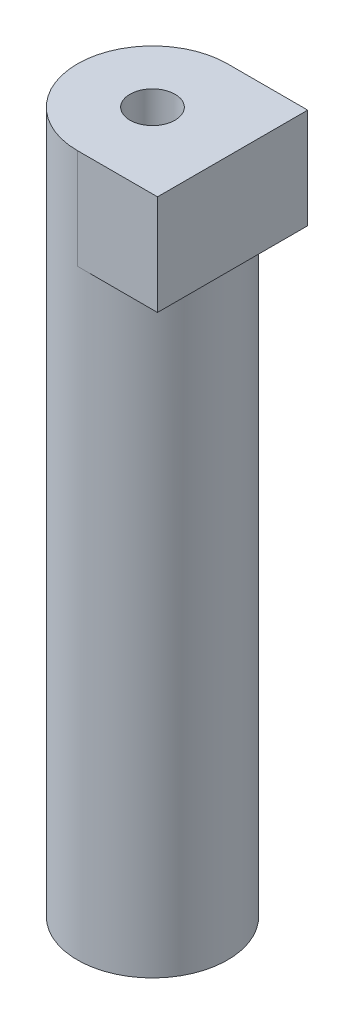
ISO-10303-21;
HEADER;
FILE_DESCRIPTION(('STEP AP214'),'2;1');
FILE_NAME('part.step','',(''),(''),'','','');
FILE_SCHEMA(('AUTOMOTIVE_DESIGN { 1 0 10303 214 1 1 1 1 }'));
ENDSEC;
DATA;
#1=APPLICATION_CONTEXT('core data for automotive mechanical design processes');
#2=APPLICATION_PROTOCOL_DEFINITION('international standard','automotive_design',2000,#1);
#3=PRODUCT_CONTEXT('',#1,'mechanical');
#4=PRODUCT('Part','Part','',(#3));
#5=PRODUCT_RELATED_PRODUCT_CATEGORY('part','',(#4));
#6=PRODUCT_DEFINITION_FORMATION('','',#4);
#7=PRODUCT_DEFINITION_CONTEXT('part definition',#1,'design');
#8=PRODUCT_DEFINITION('design','',#6,#7);
#9=PRODUCT_DEFINITION_SHAPE('','',#8);
#10=(LENGTH_UNIT() NAMED_UNIT(*) SI_UNIT(.MILLI.,.METRE.));
#11=(NAMED_UNIT(*) PLANE_ANGLE_UNIT() SI_UNIT($,.RADIAN.));
#12=(NAMED_UNIT(*) SI_UNIT($,.STERADIAN.) SOLID_ANGLE_UNIT());
#13=UNCERTAINTY_MEASURE_WITH_UNIT(LENGTH_MEASURE(1.E-05),#10,'distance_accuracy_value','');
#14=(GEOMETRIC_REPRESENTATION_CONTEXT(3) GLOBAL_UNCERTAINTY_ASSIGNED_CONTEXT((#13)) GLOBAL_UNIT_ASSIGNED_CONTEXT((#10,
#11,#12)) REPRESENTATION_CONTEXT('',''));
#15=CARTESIAN_POINT('',(0.,0.,0.));
#16=DIRECTION('',(0.,0.,1.));
#17=DIRECTION('',(1.,0.,0.));
#18=AXIS2_PLACEMENT_3D('',#15,#16,#17);
#19=CARTESIAN_POINT('',(0.,160.,0.));
#20=DIRECTION('',(0.,-1.,0.));
#21=DIRECTION('',(0.,0.,-1.));
#22=AXIS2_PLACEMENT_3D('',#19,#20,#21);
#23=CYLINDRICAL_SURFACE('',#22,7.5);
#24=CARTESIAN_POINT('',(0.,160.,0.));
#25=DIRECTION('',(0.,1.,0.));
#26=DIRECTION('',(0.,0.,1.));
#27=AXIS2_PLACEMENT_3D('',#24,#25,#26);
#28=CIRCLE('',#27,7.5);
#29=CARTESIAN_POINT('',(0.,160.,-7.5));
#30=VERTEX_POINT('',#29);
#31=CARTESIAN_POINT('',(0.,160.,7.5));
#32=VERTEX_POINT('',#31);
#33=EDGE_CURVE('E11',#30,#32,#28,.T.);
#34=ORIENTED_EDGE('',*,*,#33,.F.);
#35=DIRECTION('',(0.,1.,0.));
#36=VECTOR('',#35,1.);
#37=CARTESIAN_POINT('',(0.,150.,-7.5));
#38=LINE('',#37,#36);
#39=CARTESIAN_POINT('',(0.,150.,-7.5));
#40=VERTEX_POINT('',#39);
#41=EDGE_CURVE('E107',#40,#30,#38,.T.);
#42=ORIENTED_EDGE('',*,*,#41,.F.);
#43=CARTESIAN_POINT('',(0.,150.,0.));
#44=DIRECTION('',(0.,-1.,0.));
#45=DIRECTION('',(0.,0.,1.));
#46=AXIS2_PLACEMENT_3D('',#43,#44,#45);
#47=CIRCLE('',#46,7.5);
#48=CARTESIAN_POINT('',(0.,150.,7.5));
#49=VERTEX_POINT('',#48);
#50=EDGE_CURVE('E59',#40,#49,#47,.T.);
#51=ORIENTED_EDGE('',*,*,#50,.T.);
#52=DIRECTION('',(0.,1.,0.));
#53=VECTOR('',#52,1.);
#54=CARTESIAN_POINT('',(0.,150.,7.5));
#55=LINE('',#54,#53);
#56=EDGE_CURVE('E83',#49,#32,#55,.T.);
#57=ORIENTED_EDGE('',*,*,#56,.T.);
#58=EDGE_LOOP('',(#34,#42,#51,#57));
#59=FACE_BOUND('',#58,.T.);
#60=CARTESIAN_POINT('',(0.,90.,0.));
#61=DIRECTION('',(0.,-1.,0.));
#62=DIRECTION('',(0.,0.,-1.));
#63=AXIS2_PLACEMENT_3D('',#60,#61,#62);
#64=CIRCLE('',#63,7.5);
#65=CARTESIAN_POINT('',(0.,90.,-7.5));
#66=VERTEX_POINT('',#65);
#67=EDGE_CURVE('E104',#66,#66,#64,.T.);
#68=ORIENTED_EDGE('',*,*,#67,.F.);
#69=EDGE_LOOP('',(#68));
#70=FACE_BOUND('',#69,.T.);
#71=ADVANCED_FACE('F36',(#59,#70),#23,.T.);
#72=CARTESIAN_POINT('',(0.,80.,0.));
#73=DIRECTION('',(0.,1.,0.));
#74=DIRECTION('',(0.,0.,1.));
#75=AXIS2_PLACEMENT_3D('',#72,#73,#74);
#76=CYLINDRICAL_SURFACE('',#75,2.25);
#77=CARTESIAN_POINT('',(0.,160.,0.));
#78=DIRECTION('',(0.,1.,0.));
#79=DIRECTION('',(0.,0.,1.));
#80=AXIS2_PLACEMENT_3D('',#77,#78,#79);
#81=CIRCLE('',#80,2.25);
#82=CARTESIAN_POINT('',(0.,160.,2.25));
#83=VERTEX_POINT('',#82);
#84=EDGE_CURVE('E44',#83,#83,#81,.T.);
#85=ORIENTED_EDGE('',*,*,#84,.T.);
#86=EDGE_LOOP('',(#85));
#87=FACE_BOUND('',#86,.T.);
#88=CARTESIAN_POINT('',(0.,90.,0.));
#89=DIRECTION('',(0.,-1.,0.));
#90=DIRECTION('',(0.,0.,-1.));
#91=AXIS2_PLACEMENT_3D('',#88,#89,#90);
#92=CIRCLE('',#91,2.25);
#93=CARTESIAN_POINT('',(0.,90.,-2.25));
#94=VERTEX_POINT('',#93);
#95=EDGE_CURVE('E39',#94,#94,#92,.F.);
#96=ORIENTED_EDGE('',*,*,#95,.F.);
#97=EDGE_LOOP('',(#96));
#98=FACE_BOUND('',#97,.T.);
#99=ADVANCED_FACE('F114',(#87,#98),#76,.F.);
#100=CARTESIAN_POINT('',(0.,160.,0.));
#101=DIRECTION('',(0.,1.,0.));
#102=DIRECTION('',(0.,0.,1.));
#103=AXIS2_PLACEMENT_3D('',#100,#101,#102);
#104=PLANE('',#103);
#105=ORIENTED_EDGE('',*,*,#84,.F.);
#106=EDGE_LOOP('',(#105));
#107=FACE_BOUND('',#106,.T.);
#108=ORIENTED_EDGE('',*,*,#33,.T.);
#109=DIRECTION('',(1.,0.,0.));
#110=VECTOR('',#109,1.);
#111=CARTESIAN_POINT('',(0.,160.,7.5));
#112=LINE('',#111,#110);
#113=CARTESIAN_POINT('',(8.,160.,7.5));
#114=VERTEX_POINT('',#113);
#115=EDGE_CURVE('E102',#32,#114,#112,.T.);
#116=ORIENTED_EDGE('',*,*,#115,.T.);
#117=DIRECTION('',(0.,0.,-1.));
#118=VECTOR('',#117,1.);
#119=CARTESIAN_POINT('',(8.,160.,7.5));
#120=LINE('',#119,#118);
#121=CARTESIAN_POINT('',(8.,160.,-7.5));
#122=VERTEX_POINT('',#121);
#123=EDGE_CURVE('E89',#114,#122,#120,.T.);
#124=ORIENTED_EDGE('',*,*,#123,.T.);
#125=DIRECTION('',(-1.,0.,0.));
#126=VECTOR('',#125,1.);
#127=CARTESIAN_POINT('',(8.,160.,-7.5));
#128=LINE('',#127,#126);
#129=EDGE_CURVE('E50',#122,#30,#128,.T.);
#130=ORIENTED_EDGE('',*,*,#129,.T.);
#131=EDGE_LOOP('',(#108,#116,#124,#130));
#132=FACE_BOUND('',#131,.T.);
#133=ADVANCED_FACE('F117',(#107,#132),#104,.T.);
#134=CARTESIAN_POINT('',(8.,150.,-7.5));
#135=DIRECTION('',(0.,0.,-1.));
#136=DIRECTION('',(-1.,0.,0.));
#137=AXIS2_PLACEMENT_3D('',#134,#135,#136);
#138=PLANE('',#137);
#139=ORIENTED_EDGE('',*,*,#129,.F.);
#140=DIRECTION('',(0.,1.,0.));
#141=VECTOR('',#140,1.);
#142=CARTESIAN_POINT('',(8.,150.,-7.5));
#143=LINE('',#142,#141);
#144=CARTESIAN_POINT('',(8.,150.,-7.5));
#145=VERTEX_POINT('',#144);
#146=EDGE_CURVE('E77',#145,#122,#143,.T.);
#147=ORIENTED_EDGE('',*,*,#146,.F.);
#148=DIRECTION('',(-1.,0.,0.));
#149=VECTOR('',#148,1.);
#150=CARTESIAN_POINT('',(8.,150.,-7.5));
#151=LINE('',#150,#149);
#152=EDGE_CURVE('E94',#145,#40,#151,.T.);
#153=ORIENTED_EDGE('',*,*,#152,.T.);
#154=ORIENTED_EDGE('',*,*,#41,.T.);
#155=EDGE_LOOP('',(#139,#147,#153,#154));
#156=FACE_BOUND('',#155,.T.);
#157=ADVANCED_FACE('F119',(#156),#138,.T.);
#158=CARTESIAN_POINT('',(8.,150.,7.5));
#159=DIRECTION('',(1.,0.,0.));
#160=DIRECTION('',(0.,0.,-1.));
#161=AXIS2_PLACEMENT_3D('',#158,#159,#160);
#162=PLANE('',#161);
#163=ORIENTED_EDGE('',*,*,#123,.F.);
#164=DIRECTION('',(0.,1.,0.));
#165=VECTOR('',#164,1.);
#166=CARTESIAN_POINT('',(8.,150.,7.5));
#167=LINE('',#166,#165);
#168=CARTESIAN_POINT('',(8.,150.,7.5));
#169=VERTEX_POINT('',#168);
#170=EDGE_CURVE('E85',#169,#114,#167,.T.);
#171=ORIENTED_EDGE('',*,*,#170,.F.);
#172=DIRECTION('',(0.,0.,-1.));
#173=VECTOR('',#172,1.);
#174=CARTESIAN_POINT('',(8.,150.,7.5));
#175=LINE('',#174,#173);
#176=EDGE_CURVE('E88',#169,#145,#175,.T.);
#177=ORIENTED_EDGE('',*,*,#176,.T.);
#178=ORIENTED_EDGE('',*,*,#146,.T.);
#179=EDGE_LOOP('',(#163,#171,#177,#178));
#180=FACE_BOUND('',#179,.T.);
#181=ADVANCED_FACE('F87',(#180),#162,.T.);
#182=CARTESIAN_POINT('',(0.,150.,7.5));
#183=DIRECTION('',(0.,0.,1.));
#184=DIRECTION('',(1.,0.,0.));
#185=AXIS2_PLACEMENT_3D('',#182,#183,#184);
#186=PLANE('',#185);
#187=ORIENTED_EDGE('',*,*,#115,.F.);
#188=ORIENTED_EDGE('',*,*,#56,.F.);
#189=DIRECTION('',(1.,0.,0.));
#190=VECTOR('',#189,1.);
#191=CARTESIAN_POINT('',(0.,150.,7.5));
#192=LINE('',#191,#190);
#193=EDGE_CURVE('E93',#49,#169,#192,.T.);
#194=ORIENTED_EDGE('',*,*,#193,.T.);
#195=ORIENTED_EDGE('',*,*,#170,.T.);
#196=EDGE_LOOP('',(#187,#188,#194,#195));
#197=FACE_BOUND('',#196,.T.);
#198=ADVANCED_FACE('F96',(#197),#186,.T.);
#199=CARTESIAN_POINT('',(0.,150.,0.));
#200=DIRECTION('',(0.,1.,0.));
#201=DIRECTION('',(0.,0.,1.));
#202=AXIS2_PLACEMENT_3D('',#199,#200,#201);
#203=PLANE('',#202);
#204=ORIENTED_EDGE('',*,*,#50,.F.);
#205=ORIENTED_EDGE('',*,*,#152,.F.);
#206=ORIENTED_EDGE('',*,*,#176,.F.);
#207=ORIENTED_EDGE('',*,*,#193,.F.);
#208=EDGE_LOOP('',(#204,#205,#206,#207));
#209=FACE_BOUND('',#208,.T.);
#210=ADVANCED_FACE('F92',(#209),#203,.F.);
#211=CARTESIAN_POINT('',(0.,90.,0.));
#212=DIRECTION('',(0.,-1.,0.));
#213=DIRECTION('',(0.,0.,-1.));
#214=AXIS2_PLACEMENT_3D('',#211,#212,#213);
#215=PLANE('',#214);
#216=ORIENTED_EDGE('',*,*,#95,.T.);
#217=EDGE_LOOP('',(#216));
#218=FACE_BOUND('',#217,.T.);
#219=ORIENTED_EDGE('',*,*,#67,.T.);
#220=EDGE_LOOP('',(#219));
#221=FACE_BOUND('',#220,.T.);
#222=ADVANCED_FACE('F146',(#218,#221),#215,.T.);
#223=CLOSED_SHELL('',(#71,#99,#133,#157,#181,#198,#210,#222));
#224=MANIFOLD_SOLID_BREP('B2',#223);
#225=ADVANCED_BREP_SHAPE_REPRESENTATION('',(#18,#224),#14);
#226=SHAPE_DEFINITION_REPRESENTATION(#9,#225);
ENDSEC;
END-ISO-10303-21;
